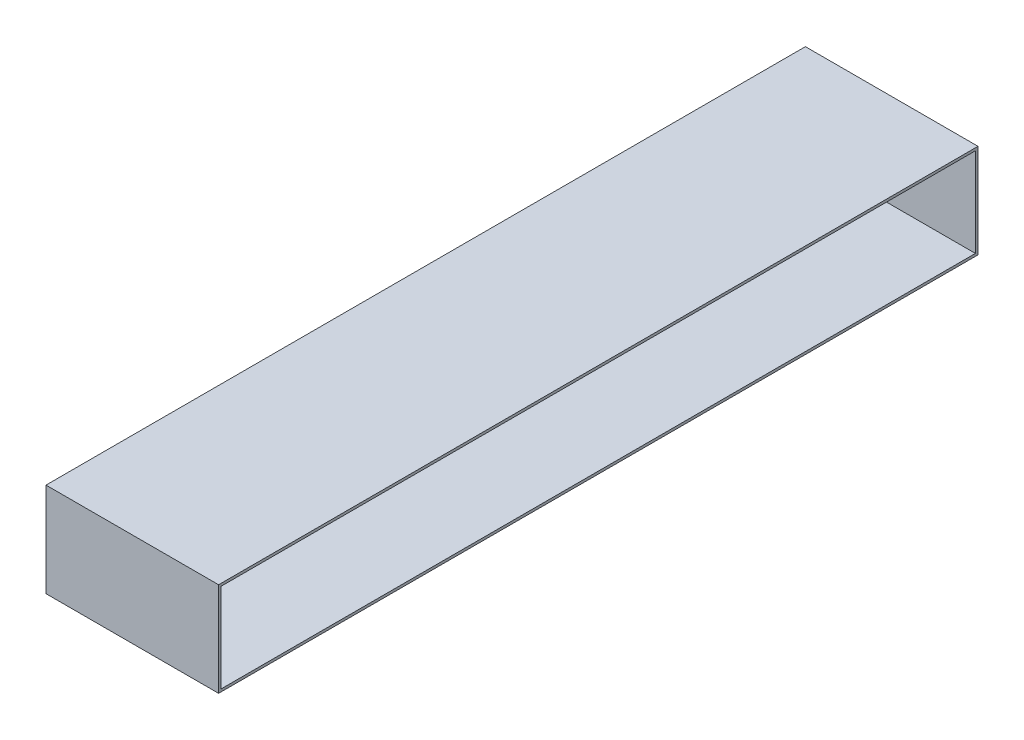
ISO-10303-21;
HEADER;
FILE_DESCRIPTION(('STEP AP214'),'2;1');
FILE_NAME('part.step','',(''),(''),'','','');
FILE_SCHEMA(('AUTOMOTIVE_DESIGN { 1 0 10303 214 1 1 1 1 }'));
ENDSEC;
DATA;
#1=APPLICATION_CONTEXT('core data for automotive mechanical design processes');
#2=APPLICATION_PROTOCOL_DEFINITION('international standard','automotive_design',2000,#1);
#3=PRODUCT_CONTEXT('',#1,'mechanical');
#4=PRODUCT('Part','Part','',(#3));
#5=PRODUCT_RELATED_PRODUCT_CATEGORY('part','',(#4));
#6=PRODUCT_DEFINITION_FORMATION('','',#4);
#7=PRODUCT_DEFINITION_CONTEXT('part definition',#1,'design');
#8=PRODUCT_DEFINITION('design','',#6,#7);
#9=PRODUCT_DEFINITION_SHAPE('','',#8);
#10=(LENGTH_UNIT() NAMED_UNIT(*) SI_UNIT(.MILLI.,.METRE.));
#11=(NAMED_UNIT(*) PLANE_ANGLE_UNIT() SI_UNIT($,.RADIAN.));
#12=(NAMED_UNIT(*) SI_UNIT($,.STERADIAN.) SOLID_ANGLE_UNIT());
#13=UNCERTAINTY_MEASURE_WITH_UNIT(LENGTH_MEASURE(1.E-05),#10,'distance_accuracy_value','');
#14=(GEOMETRIC_REPRESENTATION_CONTEXT(3) GLOBAL_UNCERTAINTY_ASSIGNED_CONTEXT((#13)) GLOBAL_UNIT_ASSIGNED_CONTEXT((#10,
#11,#12)) REPRESENTATION_CONTEXT('',''));
#15=CARTESIAN_POINT('',(0.,0.,0.));
#16=DIRECTION('',(0.,0.,1.));
#17=DIRECTION('',(1.,0.,0.));
#18=AXIS2_PLACEMENT_3D('',#15,#16,#17);
#19=CARTESIAN_POINT('',(200.,0.,-929.294825050865));
#20=DIRECTION('',(0.,0.,1.));
#21=DIRECTION('',(1.,0.,0.));
#22=AXIS2_PLACEMENT_3D('',#19,#20,#21);
#23=PLANE('',#22);
#24=DIRECTION('',(0.,1.,0.));
#25=VECTOR('',#24,1.);
#26=CARTESIAN_POINT('',(0.,0.,-929.294825050865));
#27=LINE('',#26,#25);
#28=CARTESIAN_POINT('',(0.,8.61063553757985,-929.294825050865));
#29=VERTEX_POINT('',#28);
#30=CARTESIAN_POINT('',(0.,111.61063553758,-929.294825050865));
#31=VERTEX_POINT('',#30);
#32=EDGE_CURVE('E148',#29,#31,#27,.T.);
#33=ORIENTED_EDGE('',*,*,#32,.F.);
#34=DIRECTION('',(-1.,0.,0.));
#35=VECTOR('',#34,1.);
#36=CARTESIAN_POINT('',(200.,8.61063553757985,-929.294825050865));
#37=LINE('',#36,#35);
#38=CARTESIAN_POINT('',(200.,8.61063553757985,-929.294825050865));
#39=VERTEX_POINT('',#38);
#40=EDGE_CURVE('E11',#39,#29,#37,.T.);
#41=ORIENTED_EDGE('',*,*,#40,.F.);
#42=DIRECTION('',(0.,1.,0.));
#43=VECTOR('',#42,1.);
#44=CARTESIAN_POINT('',(200.,0.,-929.294825050865));
#45=LINE('',#44,#43);
#46=CARTESIAN_POINT('',(200.,111.61063553758,-929.294825050865));
#47=VERTEX_POINT('',#46);
#48=EDGE_CURVE('E129',#39,#47,#45,.T.);
#49=ORIENTED_EDGE('',*,*,#48,.T.);
#50=DIRECTION('',(-1.,0.,0.));
#51=VECTOR('',#50,1.);
#52=CARTESIAN_POINT('',(200.,111.61063553758,-929.294825050865));
#53=LINE('',#52,#51);
#54=EDGE_CURVE('E91',#47,#31,#53,.T.);
#55=ORIENTED_EDGE('',*,*,#54,.T.);
#56=EDGE_LOOP('',(#33,#41,#49,#55));
#57=FACE_BOUND('',#56,.T.);
#58=ADVANCED_FACE('F37',(#57),#23,.T.);
#59=CARTESIAN_POINT('',(200.,8.61063553757985,0.));
#60=DIRECTION('',(0.,1.,0.));
#61=DIRECTION('',(0.,0.,1.));
#62=AXIS2_PLACEMENT_3D('',#59,#60,#61);
#63=PLANE('',#62);
#64=DIRECTION('',(0.,0.,-1.));
#65=VECTOR('',#64,1.);
#66=CARTESIAN_POINT('',(0.,8.61063553757985,0.));
#67=LINE('',#66,#65);
#68=CARTESIAN_POINT('',(0.,8.61063553757985,-55.2948250508648));
#69=VERTEX_POINT('',#68);
#70=EDGE_CURVE('E119',#69,#29,#67,.T.);
#71=ORIENTED_EDGE('',*,*,#70,.F.);
#72=DIRECTION('',(-1.,0.,0.));
#73=VECTOR('',#72,1.);
#74=CARTESIAN_POINT('',(200.,8.61063553757985,-55.2948250508648));
#75=LINE('',#74,#73);
#76=CARTESIAN_POINT('',(200.,8.61063553757985,-55.2948250508648));
#77=VERTEX_POINT('',#76);
#78=EDGE_CURVE('E47',#77,#69,#75,.T.);
#79=ORIENTED_EDGE('',*,*,#78,.F.);
#80=DIRECTION('',(0.,0.,-1.));
#81=VECTOR('',#80,1.);
#82=CARTESIAN_POINT('',(200.,8.61063553757985,0.));
#83=LINE('',#82,#81);
#84=EDGE_CURVE('E117',#77,#39,#83,.T.);
#85=ORIENTED_EDGE('',*,*,#84,.T.);
#86=ORIENTED_EDGE('',*,*,#40,.T.);
#87=EDGE_LOOP('',(#71,#79,#85,#86));
#88=FACE_BOUND('',#87,.T.);
#89=ADVANCED_FACE('F115',(#88),#63,.T.);
#90=CARTESIAN_POINT('',(200.,0.,-55.2948250508648));
#91=DIRECTION('',(0.,0.,1.));
#92=DIRECTION('',(1.,0.,0.));
#93=AXIS2_PLACEMENT_3D('',#90,#91,#92);
#94=PLANE('',#93);
#95=DIRECTION('',(0.,1.,0.));
#96=VECTOR('',#95,1.);
#97=CARTESIAN_POINT('',(0.,0.,-55.2948250508648));
#98=LINE('',#97,#96);
#99=CARTESIAN_POINT('',(0.,111.61063553758,-55.2948250508648));
#100=VERTEX_POINT('',#99);
#101=EDGE_CURVE('E151',#69,#100,#98,.T.);
#102=ORIENTED_EDGE('',*,*,#101,.T.);
#103=DIRECTION('',(-1.,0.,0.));
#104=VECTOR('',#103,1.);
#105=CARTESIAN_POINT('',(200.,111.61063553758,-55.2948250508648));
#106=LINE('',#105,#104);
#107=CARTESIAN_POINT('',(200.,111.61063553758,-55.2948250508648));
#108=VERTEX_POINT('',#107);
#109=EDGE_CURVE('E122',#108,#100,#106,.T.);
#110=ORIENTED_EDGE('',*,*,#109,.F.);
#111=DIRECTION('',(0.,1.,0.));
#112=VECTOR('',#111,1.);
#113=CARTESIAN_POINT('',(200.,0.,-55.2948250508648));
#114=LINE('',#113,#112);
#115=EDGE_CURVE('E125',#77,#108,#114,.T.);
#116=ORIENTED_EDGE('',*,*,#115,.F.);
#117=ORIENTED_EDGE('',*,*,#78,.T.);
#118=EDGE_LOOP('',(#102,#110,#116,#117));
#119=FACE_BOUND('',#118,.T.);
#120=ADVANCED_FACE('F126',(#119),#94,.F.);
#121=CARTESIAN_POINT('',(200.,0.,-52.2948250508648));
#122=DIRECTION('',(0.,0.,1.));
#123=DIRECTION('',(1.,0.,0.));
#124=AXIS2_PLACEMENT_3D('',#121,#122,#123);
#125=PLANE('',#124);
#126=DIRECTION('',(0.,1.,0.));
#127=VECTOR('',#126,1.);
#128=CARTESIAN_POINT('',(0.,0.,-52.2948250508648));
#129=LINE('',#128,#127);
#130=CARTESIAN_POINT('',(0.,5.61063553757985,-52.2948250508648));
#131=VERTEX_POINT('',#130);
#132=CARTESIAN_POINT('',(0.,114.61063553758,-52.2948250508648));
#133=VERTEX_POINT('',#132);
#134=EDGE_CURVE('E137',#131,#133,#129,.T.);
#135=ORIENTED_EDGE('',*,*,#134,.F.);
#136=DIRECTION('',(-1.,0.,0.));
#137=VECTOR('',#136,1.);
#138=CARTESIAN_POINT('',(200.,5.61063553757985,-52.2948250508648));
#139=LINE('',#138,#137);
#140=CARTESIAN_POINT('',(200.,5.61063553757985,-52.2948250508648));
#141=VERTEX_POINT('',#140);
#142=EDGE_CURVE('E41',#141,#131,#139,.T.);
#143=ORIENTED_EDGE('',*,*,#142,.F.);
#144=DIRECTION('',(0.,1.,0.));
#145=VECTOR('',#144,1.);
#146=CARTESIAN_POINT('',(200.,0.,-52.2948250508648));
#147=LINE('',#146,#145);
#148=CARTESIAN_POINT('',(200.,114.61063553758,-52.2948250508648));
#149=VERTEX_POINT('',#148);
#150=EDGE_CURVE('E154',#141,#149,#147,.T.);
#151=ORIENTED_EDGE('',*,*,#150,.T.);
#152=DIRECTION('',(-1.,0.,0.));
#153=VECTOR('',#152,1.);
#154=CARTESIAN_POINT('',(200.,114.61063553758,-52.2948250508648));
#155=LINE('',#154,#153);
#156=EDGE_CURVE('E136',#149,#133,#155,.T.);
#157=ORIENTED_EDGE('',*,*,#156,.T.);
#158=EDGE_LOOP('',(#135,#143,#151,#157));
#159=FACE_BOUND('',#158,.T.);
#160=ADVANCED_FACE('F39',(#159),#125,.T.);
#161=CARTESIAN_POINT('',(200.,5.61063553757985,0.));
#162=DIRECTION('',(0.,1.,0.));
#163=DIRECTION('',(0.,0.,1.));
#164=AXIS2_PLACEMENT_3D('',#161,#162,#163);
#165=PLANE('',#164);
#166=DIRECTION('',(0.,0.,-1.));
#167=VECTOR('',#166,1.);
#168=CARTESIAN_POINT('',(0.,5.61063553757985,0.));
#169=LINE('',#168,#167);
#170=CARTESIAN_POINT('',(0.,5.61063553757985,-932.294825050865));
#171=VERTEX_POINT('',#170);
#172=EDGE_CURVE('E140',#131,#171,#169,.T.);
#173=ORIENTED_EDGE('',*,*,#172,.T.);
#174=DIRECTION('',(-1.,0.,0.));
#175=VECTOR('',#174,1.);
#176=CARTESIAN_POINT('',(200.,5.61063553757985,-932.294825050865));
#177=LINE('',#176,#175);
#178=CARTESIAN_POINT('',(200.,5.61063553757985,-932.294825050865));
#179=VERTEX_POINT('',#178);
#180=EDGE_CURVE('E159',#179,#171,#177,.T.);
#181=ORIENTED_EDGE('',*,*,#180,.F.);
#182=DIRECTION('',(0.,0.,-1.));
#183=VECTOR('',#182,1.);
#184=CARTESIAN_POINT('',(200.,5.61063553757985,0.));
#185=LINE('',#184,#183);
#186=EDGE_CURVE('E168',#141,#179,#185,.T.);
#187=ORIENTED_EDGE('',*,*,#186,.F.);
#188=ORIENTED_EDGE('',*,*,#142,.T.);
#189=EDGE_LOOP('',(#173,#181,#187,#188));
#190=FACE_BOUND('',#189,.T.);
#191=ADVANCED_FACE('F167',(#190),#165,.F.);
#192=CARTESIAN_POINT('',(200.,0.,-932.294825050865));
#193=DIRECTION('',(0.,0.,1.));
#194=DIRECTION('',(1.,0.,0.));
#195=AXIS2_PLACEMENT_3D('',#192,#193,#194);
#196=PLANE('',#195);
#197=DIRECTION('',(0.,1.,0.));
#198=VECTOR('',#197,1.);
#199=CARTESIAN_POINT('',(0.,0.,-932.294825050865));
#200=LINE('',#199,#198);
#201=CARTESIAN_POINT('',(0.,114.61063553758,-932.294825050865));
#202=VERTEX_POINT('',#201);
#203=EDGE_CURVE('E142',#171,#202,#200,.T.);
#204=ORIENTED_EDGE('',*,*,#203,.T.);
#205=DIRECTION('',(-1.,0.,0.));
#206=VECTOR('',#205,1.);
#207=CARTESIAN_POINT('',(200.,114.61063553758,-932.294825050865));
#208=LINE('',#207,#206);
#209=CARTESIAN_POINT('',(200.,114.61063553758,-932.294825050865));
#210=VERTEX_POINT('',#209);
#211=EDGE_CURVE('E158',#210,#202,#208,.T.);
#212=ORIENTED_EDGE('',*,*,#211,.F.);
#213=DIRECTION('',(0.,1.,0.));
#214=VECTOR('',#213,1.);
#215=CARTESIAN_POINT('',(200.,0.,-932.294825050865));
#216=LINE('',#215,#214);
#217=EDGE_CURVE('E206',#179,#210,#216,.T.);
#218=ORIENTED_EDGE('',*,*,#217,.F.);
#219=ORIENTED_EDGE('',*,*,#180,.T.);
#220=EDGE_LOOP('',(#204,#212,#218,#219));
#221=FACE_BOUND('',#220,.T.);
#222=ADVANCED_FACE('F178',(#221),#196,.F.);
#223=CARTESIAN_POINT('',(200.,114.61063553758,0.));
#224=DIRECTION('',(0.,1.,0.));
#225=DIRECTION('',(0.,0.,1.));
#226=AXIS2_PLACEMENT_3D('',#223,#224,#225);
#227=PLANE('',#226);
#228=DIRECTION('',(0.,0.,-1.));
#229=VECTOR('',#228,1.);
#230=CARTESIAN_POINT('',(0.,114.61063553758,0.));
#231=LINE('',#230,#229);
#232=EDGE_CURVE('E145',#133,#202,#231,.T.);
#233=ORIENTED_EDGE('',*,*,#232,.F.);
#234=ORIENTED_EDGE('',*,*,#156,.F.);
#235=DIRECTION('',(0.,0.,-1.));
#236=VECTOR('',#235,1.);
#237=CARTESIAN_POINT('',(200.,114.61063553758,0.));
#238=LINE('',#237,#236);
#239=EDGE_CURVE('E131',#149,#210,#238,.T.);
#240=ORIENTED_EDGE('',*,*,#239,.T.);
#241=ORIENTED_EDGE('',*,*,#211,.T.);
#242=EDGE_LOOP('',(#233,#234,#240,#241));
#243=FACE_BOUND('',#242,.T.);
#244=ADVANCED_FACE('F176',(#243),#227,.T.);
#245=CARTESIAN_POINT('',(200.,111.61063553758,0.));
#246=DIRECTION('',(0.,1.,0.));
#247=DIRECTION('',(0.,0.,1.));
#248=AXIS2_PLACEMENT_3D('',#245,#246,#247);
#249=PLANE('',#248);
#250=DIRECTION('',(0.,0.,-1.));
#251=VECTOR('',#250,1.);
#252=CARTESIAN_POINT('',(0.,111.61063553758,0.));
#253=LINE('',#252,#251);
#254=EDGE_CURVE('E84',#100,#31,#253,.T.);
#255=ORIENTED_EDGE('',*,*,#254,.T.);
#256=ORIENTED_EDGE('',*,*,#54,.F.);
#257=DIRECTION('',(0.,0.,-1.));
#258=VECTOR('',#257,1.);
#259=CARTESIAN_POINT('',(200.,111.61063553758,0.));
#260=LINE('',#259,#258);
#261=EDGE_CURVE('E56',#108,#47,#260,.T.);
#262=ORIENTED_EDGE('',*,*,#261,.F.);
#263=ORIENTED_EDGE('',*,*,#109,.T.);
#264=EDGE_LOOP('',(#255,#256,#262,#263));
#265=FACE_BOUND('',#264,.T.);
#266=ADVANCED_FACE('F185',(#265),#249,.F.);
#267=CARTESIAN_POINT('',(200.,0.,0.));
#268=DIRECTION('',(1.,0.,0.));
#269=DIRECTION('',(0.,0.,-1.));
#270=AXIS2_PLACEMENT_3D('',#267,#268,#269);
#271=PLANE('',#270);
#272=ORIENTED_EDGE('',*,*,#150,.F.);
#273=ORIENTED_EDGE('',*,*,#186,.T.);
#274=ORIENTED_EDGE('',*,*,#217,.T.);
#275=ORIENTED_EDGE('',*,*,#239,.F.);
#276=EDGE_LOOP('',(#272,#273,#274,#275));
#277=FACE_BOUND('',#276,.T.);
#278=ORIENTED_EDGE('',*,*,#48,.F.);
#279=ORIENTED_EDGE('',*,*,#84,.F.);
#280=ORIENTED_EDGE('',*,*,#115,.T.);
#281=ORIENTED_EDGE('',*,*,#261,.T.);
#282=EDGE_LOOP('',(#278,#279,#280,#281));
#283=FACE_BOUND('',#282,.T.);
#284=ADVANCED_FACE('F128',(#277,#283),#271,.T.);
#285=CARTESIAN_POINT('',(0.,0.,0.));
#286=DIRECTION('',(1.,0.,0.));
#287=DIRECTION('',(0.,0.,-1.));
#288=AXIS2_PLACEMENT_3D('',#285,#286,#287);
#289=PLANE('',#288);
#290=ORIENTED_EDGE('',*,*,#134,.T.);
#291=ORIENTED_EDGE('',*,*,#232,.T.);
#292=ORIENTED_EDGE('',*,*,#203,.F.);
#293=ORIENTED_EDGE('',*,*,#172,.F.);
#294=EDGE_LOOP('',(#290,#291,#292,#293));
#295=FACE_BOUND('',#294,.T.);
#296=ORIENTED_EDGE('',*,*,#32,.T.);
#297=ORIENTED_EDGE('',*,*,#254,.F.);
#298=ORIENTED_EDGE('',*,*,#101,.F.);
#299=ORIENTED_EDGE('',*,*,#70,.T.);
#300=EDGE_LOOP('',(#296,#297,#298,#299));
#301=FACE_BOUND('',#300,.T.);
#302=ADVANCED_FACE('F171',(#295,#301),#289,.F.);
#303=CLOSED_SHELL('',(#58,#89,#120,#160,#191,#222,#244,#266,#284,#302));
#304=MANIFOLD_SOLID_BREP('B2',#303);
#305=ADVANCED_BREP_SHAPE_REPRESENTATION('',(#18,#304),#14);
#306=SHAPE_DEFINITION_REPRESENTATION(#9,#305);
ENDSEC;
END-ISO-10303-21;
